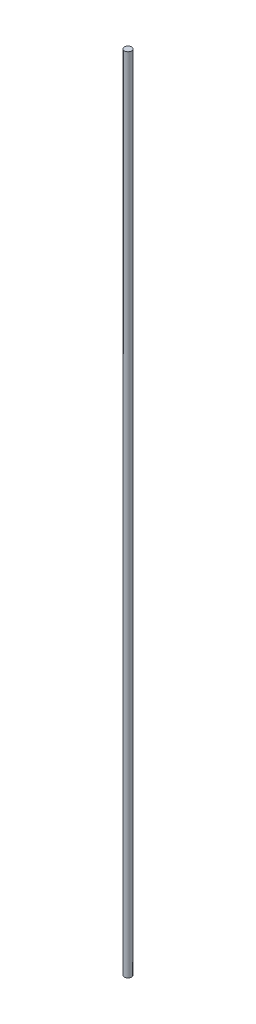
ISO-10303-21;
HEADER;
FILE_DESCRIPTION(('STEP AP214'),'2;1');
FILE_NAME('part.step','',(''),(''),'','','');
FILE_SCHEMA(('AUTOMOTIVE_DESIGN { 1 0 10303 214 1 1 1 1 }'));
ENDSEC;
DATA;
#1=APPLICATION_CONTEXT('core data for automotive mechanical design processes');
#2=APPLICATION_PROTOCOL_DEFINITION('international standard','automotive_design',2000,#1);
#3=PRODUCT_CONTEXT('',#1,'mechanical');
#4=PRODUCT('Part','Part','',(#3));
#5=PRODUCT_RELATED_PRODUCT_CATEGORY('part','',(#4));
#6=PRODUCT_DEFINITION_FORMATION('','',#4);
#7=PRODUCT_DEFINITION_CONTEXT('part definition',#1,'design');
#8=PRODUCT_DEFINITION('design','',#6,#7);
#9=PRODUCT_DEFINITION_SHAPE('','',#8);
#10=(LENGTH_UNIT() NAMED_UNIT(*) SI_UNIT(.MILLI.,.METRE.));
#11=(NAMED_UNIT(*) PLANE_ANGLE_UNIT() SI_UNIT($,.RADIAN.));
#12=(NAMED_UNIT(*) SI_UNIT($,.STERADIAN.) SOLID_ANGLE_UNIT());
#13=UNCERTAINTY_MEASURE_WITH_UNIT(LENGTH_MEASURE(1.E-05),#10,'distance_accuracy_value','');
#14=(GEOMETRIC_REPRESENTATION_CONTEXT(3) GLOBAL_UNCERTAINTY_ASSIGNED_CONTEXT((#13)) GLOBAL_UNIT_ASSIGNED_CONTEXT((#10,
#11,#12)) REPRESENTATION_CONTEXT('',''));
#15=CARTESIAN_POINT('',(0.,0.,0.));
#16=DIRECTION('',(0.,0.,1.));
#17=DIRECTION('',(1.,0.,0.));
#18=AXIS2_PLACEMENT_3D('',#15,#16,#17);
#19=CARTESIAN_POINT('',(0.,-36.,0.));
#20=DIRECTION('',(0.,1.,0.));
#21=DIRECTION('',(0.,0.,1.));
#22=AXIS2_PLACEMENT_3D('',#19,#20,#21);
#23=PLANE('',#22);
#24=CARTESIAN_POINT('',(0.,-36.,0.));
#25=DIRECTION('',(0.,-1.,0.));
#26=DIRECTION('',(0.,0.,-1.));
#27=AXIS2_PLACEMENT_3D('',#24,#25,#26);
#28=CIRCLE('',#27,0.75);
#29=CARTESIAN_POINT('',(0.,-36.,-0.75));
#30=VERTEX_POINT('',#29);
#31=EDGE_CURVE('E10',#30,#30,#28,.T.);
#32=ORIENTED_EDGE('',*,*,#31,.F.);
#33=EDGE_LOOP('',(#32));
#34=FACE_BOUND('',#33,.T.);
#35=ADVANCED_FACE('F31',(#34),#23,.T.);
#36=CARTESIAN_POINT('',(0.,-210.,0.));
#37=DIRECTION('',(0.,-1.,0.));
#38=DIRECTION('',(0.,0.,-1.));
#39=AXIS2_PLACEMENT_3D('',#36,#37,#38);
#40=CYLINDRICAL_SURFACE('',#39,0.75);
#41=ORIENTED_EDGE('',*,*,#31,.T.);
#42=EDGE_LOOP('',(#41));
#43=FACE_BOUND('',#42,.T.);
#44=CARTESIAN_POINT('',(0.,-206.,0.));
#45=DIRECTION('',(0.,-1.,0.));
#46=DIRECTION('',(0.,0.,-1.));
#47=AXIS2_PLACEMENT_3D('',#44,#45,#46);
#48=CIRCLE('',#47,0.75);
#49=CARTESIAN_POINT('',(0.,-206.,-0.75));
#50=VERTEX_POINT('',#49);
#51=EDGE_CURVE('E37',#50,#50,#48,.T.);
#52=ORIENTED_EDGE('',*,*,#51,.F.);
#53=EDGE_LOOP('',(#52));
#54=FACE_BOUND('',#53,.T.);
#55=ADVANCED_FACE('F45',(#43,#54),#40,.T.);
#56=CARTESIAN_POINT('',(0.75,-206.,0.));
#57=DIRECTION('',(0.,-1.,0.));
#58=DIRECTION('',(0.,0.,-1.));
#59=AXIS2_PLACEMENT_3D('',#56,#57,#58);
#60=PLANE('',#59);
#61=ORIENTED_EDGE('',*,*,#51,.T.);
#62=EDGE_LOOP('',(#61));
#63=FACE_BOUND('',#62,.T.);
#64=ADVANCED_FACE('F43',(#63),#60,.T.);
#65=CLOSED_SHELL('',(#35,#55,#64));
#66=MANIFOLD_SOLID_BREP('B2',#65);
#67=ADVANCED_BREP_SHAPE_REPRESENTATION('',(#18,#66),#14);
#68=SHAPE_DEFINITION_REPRESENTATION(#9,#67);
ENDSEC;
END-ISO-10303-21;
